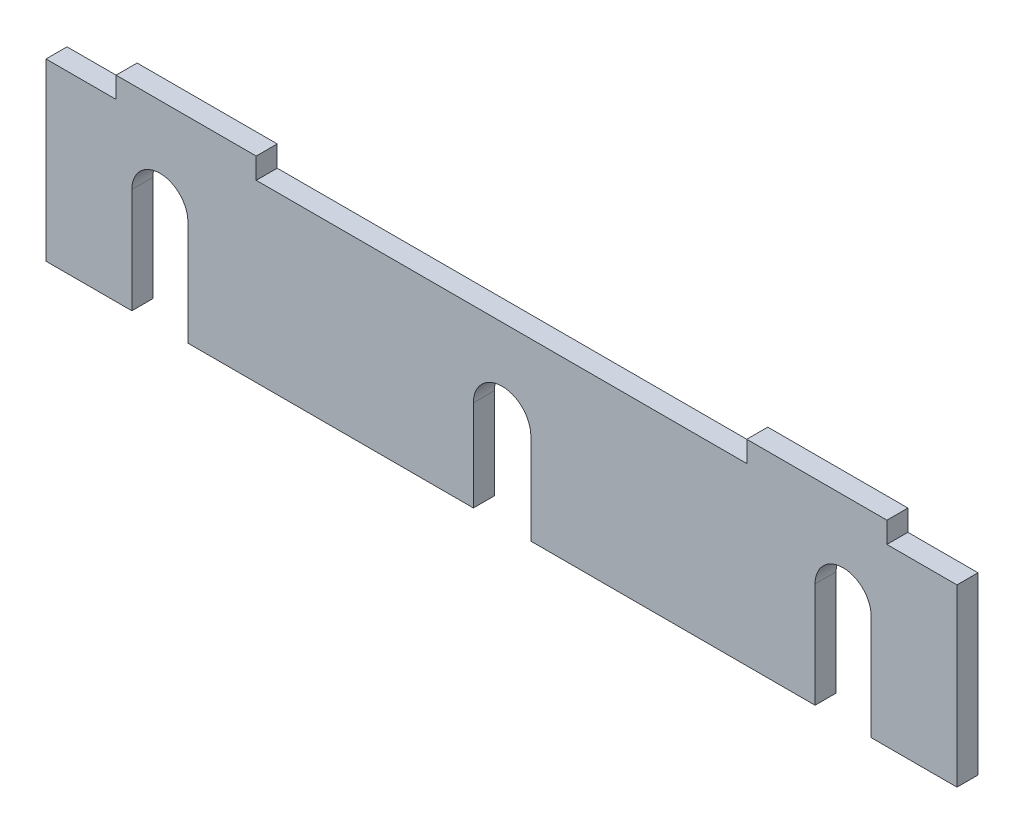
ISO-10303-21;
HEADER;
FILE_DESCRIPTION(('STEP AP214'),'2;1');
FILE_NAME('part.step','',(''),(''),'','','');
FILE_SCHEMA(('AUTOMOTIVE_DESIGN { 1 0 10303 214 1 1 1 1 }'));
ENDSEC;
DATA;
#1=APPLICATION_CONTEXT('core data for automotive mechanical design processes');
#2=APPLICATION_PROTOCOL_DEFINITION('international standard','automotive_design',2000,#1);
#3=PRODUCT_CONTEXT('',#1,'mechanical');
#4=PRODUCT('Part','Part','',(#3));
#5=PRODUCT_RELATED_PRODUCT_CATEGORY('part','',(#4));
#6=PRODUCT_DEFINITION_FORMATION('','',#4);
#7=PRODUCT_DEFINITION_CONTEXT('part definition',#1,'design');
#8=PRODUCT_DEFINITION('design','',#6,#7);
#9=PRODUCT_DEFINITION_SHAPE('','',#8);
#10=(LENGTH_UNIT() NAMED_UNIT(*) SI_UNIT(.MILLI.,.METRE.));
#11=(NAMED_UNIT(*) PLANE_ANGLE_UNIT() SI_UNIT($,.RADIAN.));
#12=(NAMED_UNIT(*) SI_UNIT($,.STERADIAN.) SOLID_ANGLE_UNIT());
#13=UNCERTAINTY_MEASURE_WITH_UNIT(LENGTH_MEASURE(1.E-05),#10,'distance_accuracy_value','');
#14=(GEOMETRIC_REPRESENTATION_CONTEXT(3) GLOBAL_UNCERTAINTY_ASSIGNED_CONTEXT((#13)) GLOBAL_UNIT_ASSIGNED_CONTEXT((#10,
#11,#12)) REPRESENTATION_CONTEXT('',''));
#15=CARTESIAN_POINT('',(0.,0.,0.));
#16=DIRECTION('',(0.,0.,1.));
#17=DIRECTION('',(1.,0.,0.));
#18=AXIS2_PLACEMENT_3D('',#15,#16,#17);
#19=CARTESIAN_POINT('',(10.,3.,3.));
#20=DIRECTION('',(0.,1.,0.));
#21=DIRECTION('',(0.,0.,1.));
#22=AXIS2_PLACEMENT_3D('',#19,#20,#21);
#23=PLANE('',#22);
#24=DIRECTION('',(1.,0.,0.));
#25=VECTOR('',#24,1.);
#26=CARTESIAN_POINT('',(10.,3.,0.));
#27=LINE('',#26,#25);
#28=CARTESIAN_POINT('',(10.,3.,0.));
#29=VERTEX_POINT('',#28);
#30=CARTESIAN_POINT('',(30.,3.,0.));
#31=VERTEX_POINT('',#30);
#32=EDGE_CURVE('E233',#29,#31,#27,.T.);
#33=ORIENTED_EDGE('',*,*,#32,.F.);
#34=DIRECTION('',(0.,0.,-1.));
#35=VECTOR('',#34,1.);
#36=CARTESIAN_POINT('',(10.,3.,3.));
#37=LINE('',#36,#35);
#38=CARTESIAN_POINT('',(10.,3.,3.));
#39=VERTEX_POINT('',#38);
#40=EDGE_CURVE('E11',#39,#29,#37,.T.);
#41=ORIENTED_EDGE('',*,*,#40,.F.);
#42=DIRECTION('',(1.,0.,0.));
#43=VECTOR('',#42,1.);
#44=CARTESIAN_POINT('',(10.,3.,3.));
#45=LINE('',#44,#43);
#46=CARTESIAN_POINT('',(30.,3.,3.));
#47=VERTEX_POINT('',#46);
#48=EDGE_CURVE('E322',#39,#47,#45,.T.);
#49=ORIENTED_EDGE('',*,*,#48,.T.);
#50=DIRECTION('',(0.,0.,-1.));
#51=VECTOR('',#50,1.);
#52=CARTESIAN_POINT('',(30.,3.,3.));
#53=LINE('',#52,#51);
#54=EDGE_CURVE('E41',#47,#31,#53,.T.);
#55=ORIENTED_EDGE('',*,*,#54,.T.);
#56=EDGE_LOOP('',(#33,#41,#49,#55));
#57=FACE_BOUND('',#56,.T.);
#58=ADVANCED_FACE('F38',(#57),#23,.T.);
#59=CARTESIAN_POINT('',(10.,0.,3.));
#60=DIRECTION('',(-1.,0.,0.));
#61=DIRECTION('',(0.,0.,1.));
#62=AXIS2_PLACEMENT_3D('',#59,#60,#61);
#63=PLANE('',#62);
#64=DIRECTION('',(0.,1.,0.));
#65=VECTOR('',#64,1.);
#66=CARTESIAN_POINT('',(10.,0.,0.));
#67=LINE('',#66,#65);
#68=CARTESIAN_POINT('',(10.,0.,0.));
#69=VERTEX_POINT('',#68);
#70=EDGE_CURVE('E319',#69,#29,#67,.T.);
#71=ORIENTED_EDGE('',*,*,#70,.F.);
#72=DIRECTION('',(0.,0.,-1.));
#73=VECTOR('',#72,1.);
#74=CARTESIAN_POINT('',(10.,0.,3.));
#75=LINE('',#74,#73);
#76=CARTESIAN_POINT('',(10.,0.,3.));
#77=VERTEX_POINT('',#76);
#78=EDGE_CURVE('E48',#77,#69,#75,.T.);
#79=ORIENTED_EDGE('',*,*,#78,.F.);
#80=DIRECTION('',(0.,1.,0.));
#81=VECTOR('',#80,1.);
#82=CARTESIAN_POINT('',(10.,0.,3.));
#83=LINE('',#82,#81);
#84=EDGE_CURVE('E226',#77,#39,#83,.T.);
#85=ORIENTED_EDGE('',*,*,#84,.T.);
#86=ORIENTED_EDGE('',*,*,#40,.T.);
#87=EDGE_LOOP('',(#71,#79,#85,#86));
#88=FACE_BOUND('',#87,.T.);
#89=ADVANCED_FACE('F391',(#88),#63,.T.);
#90=CARTESIAN_POINT('',(0.,0.,3.));
#91=DIRECTION('',(0.,1.,0.));
#92=DIRECTION('',(0.,0.,1.));
#93=AXIS2_PLACEMENT_3D('',#90,#91,#92);
#94=PLANE('',#93);
#95=DIRECTION('',(1.,0.,0.));
#96=VECTOR('',#95,1.);
#97=CARTESIAN_POINT('',(0.,0.,0.));
#98=LINE('',#97,#96);
#99=CARTESIAN_POINT('',(0.,0.,0.));
#100=VERTEX_POINT('',#99);
#101=EDGE_CURVE('E210',#100,#69,#98,.T.);
#102=ORIENTED_EDGE('',*,*,#101,.F.);
#103=DIRECTION('',(0.,0.,-1.));
#104=VECTOR('',#103,1.);
#105=CARTESIAN_POINT('',(0.,0.,3.));
#106=LINE('',#105,#104);
#107=CARTESIAN_POINT('',(0.,0.,3.));
#108=VERTEX_POINT('',#107);
#109=EDGE_CURVE('E204',#108,#100,#106,.T.);
#110=ORIENTED_EDGE('',*,*,#109,.F.);
#111=DIRECTION('',(1.,0.,0.));
#112=VECTOR('',#111,1.);
#113=CARTESIAN_POINT('',(0.,0.,3.));
#114=LINE('',#113,#112);
#115=EDGE_CURVE('E208',#108,#77,#114,.T.);
#116=ORIENTED_EDGE('',*,*,#115,.T.);
#117=ORIENTED_EDGE('',*,*,#78,.T.);
#118=EDGE_LOOP('',(#102,#110,#116,#117));
#119=FACE_BOUND('',#118,.T.);
#120=ADVANCED_FACE('F206',(#119),#94,.T.);
#121=CARTESIAN_POINT('',(0.,0.,3.));
#122=DIRECTION('',(1.,0.,0.));
#123=DIRECTION('',(0.,1.,0.));
#124=AXIS2_PLACEMENT_3D('',#121,#122,#123);
#125=PLANE('',#124);
#126=DIRECTION('',(0.,-1.,0.));
#127=VECTOR('',#126,1.);
#128=CARTESIAN_POINT('',(0.,0.,0.));
#129=LINE('',#128,#127);
#130=CARTESIAN_POINT('',(0.,-25.,0.));
#131=VERTEX_POINT('',#130);
#132=EDGE_CURVE('E314',#100,#131,#129,.T.);
#133=ORIENTED_EDGE('',*,*,#132,.T.);
#134=DIRECTION('',(0.,0.,-1.));
#135=VECTOR('',#134,1.);
#136=CARTESIAN_POINT('',(0.,-25.,3.));
#137=LINE('',#136,#135);
#138=CARTESIAN_POINT('',(0.,-25.,3.));
#139=VERTEX_POINT('',#138);
#140=EDGE_CURVE('E214',#139,#131,#137,.T.);
#141=ORIENTED_EDGE('',*,*,#140,.F.);
#142=DIRECTION('',(0.,-1.,0.));
#143=VECTOR('',#142,1.);
#144=CARTESIAN_POINT('',(0.,0.,3.));
#145=LINE('',#144,#143);
#146=EDGE_CURVE('E217',#108,#139,#145,.T.);
#147=ORIENTED_EDGE('',*,*,#146,.F.);
#148=ORIENTED_EDGE('',*,*,#109,.T.);
#149=EDGE_LOOP('',(#133,#141,#147,#148));
#150=FACE_BOUND('',#149,.T.);
#151=ADVANCED_FACE('F218',(#150),#125,.F.);
#152=CARTESIAN_POINT('',(0.,-25.,3.));
#153=DIRECTION('',(0.,1.,0.));
#154=DIRECTION('',(-1.,0.,0.));
#155=AXIS2_PLACEMENT_3D('',#152,#153,#154);
#156=PLANE('',#155);
#157=DIRECTION('',(1.,0.,0.));
#158=VECTOR('',#157,1.);
#159=CARTESIAN_POINT('',(0.,-25.,0.));
#160=LINE('',#159,#158);
#161=CARTESIAN_POINT('',(12.25,-25.,0.));
#162=VERTEX_POINT('',#161);
#163=EDGE_CURVE('E311',#131,#162,#160,.T.);
#164=ORIENTED_EDGE('',*,*,#163,.T.);
#165=DIRECTION('',(0.,0.,-1.));
#166=VECTOR('',#165,1.);
#167=CARTESIAN_POINT('',(12.25,-25.,3.));
#168=LINE('',#167,#166);
#169=CARTESIAN_POINT('',(12.25,-25.,3.));
#170=VERTEX_POINT('',#169);
#171=EDGE_CURVE('E328',#170,#162,#168,.T.);
#172=ORIENTED_EDGE('',*,*,#171,.F.);
#173=DIRECTION('',(1.,0.,0.));
#174=VECTOR('',#173,1.);
#175=CARTESIAN_POINT('',(0.,-25.,3.));
#176=LINE('',#175,#174);
#177=EDGE_CURVE('E223',#139,#170,#176,.T.);
#178=ORIENTED_EDGE('',*,*,#177,.F.);
#179=ORIENTED_EDGE('',*,*,#140,.T.);
#180=EDGE_LOOP('',(#164,#172,#178,#179));
#181=FACE_BOUND('',#180,.T.);
#182=ADVANCED_FACE('F404',(#181),#156,.F.);
#183=CARTESIAN_POINT('',(12.25,-25.,3.));
#184=DIRECTION('',(-1.,0.,0.));
#185=DIRECTION('',(0.,-1.,0.));
#186=AXIS2_PLACEMENT_3D('',#183,#184,#185);
#187=PLANE('',#186);
#188=DIRECTION('',(0.,1.,0.));
#189=VECTOR('',#188,1.);
#190=CARTESIAN_POINT('',(12.25,-25.,0.));
#191=LINE('',#190,#189);
#192=CARTESIAN_POINT('',(12.25,-10.,0.));
#193=VERTEX_POINT('',#192);
#194=EDGE_CURVE('E307',#162,#193,#191,.T.);
#195=ORIENTED_EDGE('',*,*,#194,.T.);
#196=DIRECTION('',(0.,0.,-1.));
#197=VECTOR('',#196,1.);
#198=CARTESIAN_POINT('',(12.25,-10.,3.));
#199=LINE('',#198,#197);
#200=CARTESIAN_POINT('',(12.25,-10.,3.));
#201=VERTEX_POINT('',#200);
#202=EDGE_CURVE('E332',#201,#193,#199,.T.);
#203=ORIENTED_EDGE('',*,*,#202,.F.);
#204=DIRECTION('',(0.,1.,0.));
#205=VECTOR('',#204,1.);
#206=CARTESIAN_POINT('',(12.25,-25.,3.));
#207=LINE('',#206,#205);
#208=EDGE_CURVE('E704',#170,#201,#207,.T.);
#209=ORIENTED_EDGE('',*,*,#208,.F.);
#210=ORIENTED_EDGE('',*,*,#171,.T.);
#211=EDGE_LOOP('',(#195,#203,#209,#210));
#212=FACE_BOUND('',#211,.T.);
#213=ADVANCED_FACE('F407',(#212),#187,.F.);
#214=CARTESIAN_POINT('',(16.25,-10.,3.));
#215=DIRECTION('',(0.,0.,-1.));
#216=DIRECTION('',(-1.,0.,0.));
#217=AXIS2_PLACEMENT_3D('',#214,#215,#216);
#218=CYLINDRICAL_SURFACE('',#217,4.);
#219=CARTESIAN_POINT('',(16.25,-10.,0.));
#220=DIRECTION('',(0.,0.,1.));
#221=DIRECTION('',(1.,0.,0.));
#222=AXIS2_PLACEMENT_3D('',#219,#220,#221);
#223=CIRCLE('',#222,4.);
#224=CARTESIAN_POINT('',(20.25,-10.,0.));
#225=VERTEX_POINT('',#224);
#226=EDGE_CURVE('E303',#225,#193,#223,.T.);
#227=ORIENTED_EDGE('',*,*,#226,.F.);
#228=DIRECTION('',(0.,0.,-1.));
#229=VECTOR('',#228,1.);
#230=CARTESIAN_POINT('',(20.25,-10.,3.));
#231=LINE('',#230,#229);
#232=CARTESIAN_POINT('',(20.25,-10.,3.));
#233=VERTEX_POINT('',#232);
#234=EDGE_CURVE('E335',#233,#225,#231,.T.);
#235=ORIENTED_EDGE('',*,*,#234,.F.);
#236=CARTESIAN_POINT('',(16.25,-10.,3.));
#237=DIRECTION('',(0.,0.,1.));
#238=DIRECTION('',(1.,0.,0.));
#239=AXIS2_PLACEMENT_3D('',#236,#237,#238);
#240=CIRCLE('',#239,4.);
#241=EDGE_CURVE('E699',#233,#201,#240,.T.);
#242=ORIENTED_EDGE('',*,*,#241,.T.);
#243=ORIENTED_EDGE('',*,*,#202,.T.);
#244=EDGE_LOOP('',(#227,#235,#242,#243));
#245=FACE_BOUND('',#244,.T.);
#246=ADVANCED_FACE('F411',(#245),#218,.F.);
#247=CARTESIAN_POINT('',(20.25,-10.,3.));
#248=DIRECTION('',(1.,0.,0.));
#249=DIRECTION('',(0.,0.,-1.));
#250=AXIS2_PLACEMENT_3D('',#247,#248,#249);
#251=PLANE('',#250);
#252=DIRECTION('',(0.,-1.,0.));
#253=VECTOR('',#252,1.);
#254=CARTESIAN_POINT('',(20.25,-10.,0.));
#255=LINE('',#254,#253);
#256=CARTESIAN_POINT('',(20.25,-25.,0.));
#257=VERTEX_POINT('',#256);
#258=EDGE_CURVE('E300',#225,#257,#255,.T.);
#259=ORIENTED_EDGE('',*,*,#258,.T.);
#260=DIRECTION('',(0.,0.,-1.));
#261=VECTOR('',#260,1.);
#262=CARTESIAN_POINT('',(20.25,-25.,3.));
#263=LINE('',#262,#261);
#264=CARTESIAN_POINT('',(20.25,-25.,3.));
#265=VERTEX_POINT('',#264);
#266=EDGE_CURVE('E338',#265,#257,#263,.T.);
#267=ORIENTED_EDGE('',*,*,#266,.F.);
#268=DIRECTION('',(0.,-1.,0.));
#269=VECTOR('',#268,1.);
#270=CARTESIAN_POINT('',(20.25,-10.,3.));
#271=LINE('',#270,#269);
#272=EDGE_CURVE('E693',#233,#265,#271,.T.);
#273=ORIENTED_EDGE('',*,*,#272,.F.);
#274=ORIENTED_EDGE('',*,*,#234,.T.);
#275=EDGE_LOOP('',(#259,#267,#273,#274));
#276=FACE_BOUND('',#275,.T.);
#277=ADVANCED_FACE('F415',(#276),#251,.F.);
#278=CARTESIAN_POINT('',(20.25,-25.,3.));
#279=DIRECTION('',(0.,1.,0.));
#280=DIRECTION('',(0.,0.,1.));
#281=AXIS2_PLACEMENT_3D('',#278,#279,#280);
#282=PLANE('',#281);
#283=DIRECTION('',(1.,0.,0.));
#284=VECTOR('',#283,1.);
#285=CARTESIAN_POINT('',(20.25,-25.,0.));
#286=LINE('',#285,#284);
#287=CARTESIAN_POINT('',(60.99,-25.,0.));
#288=VERTEX_POINT('',#287);
#289=EDGE_CURVE('E297',#257,#288,#286,.T.);
#290=ORIENTED_EDGE('',*,*,#289,.T.);
#291=DIRECTION('',(0.,0.,-1.));
#292=VECTOR('',#291,1.);
#293=CARTESIAN_POINT('',(60.99,-25.,3.));
#294=LINE('',#293,#292);
#295=CARTESIAN_POINT('',(60.99,-25.,3.));
#296=VERTEX_POINT('',#295);
#297=EDGE_CURVE('E342',#296,#288,#294,.T.);
#298=ORIENTED_EDGE('',*,*,#297,.F.);
#299=DIRECTION('',(1.,0.,0.));
#300=VECTOR('',#299,1.);
#301=CARTESIAN_POINT('',(20.25,-25.,3.));
#302=LINE('',#301,#300);
#303=EDGE_CURVE('E690',#265,#296,#302,.T.);
#304=ORIENTED_EDGE('',*,*,#303,.F.);
#305=ORIENTED_EDGE('',*,*,#266,.T.);
#306=EDGE_LOOP('',(#290,#298,#304,#305));
#307=FACE_BOUND('',#306,.T.);
#308=ADVANCED_FACE('F419',(#307),#282,.F.);
#309=CARTESIAN_POINT('',(60.99,-25.,3.));
#310=DIRECTION('',(-1.,0.,0.));
#311=DIRECTION('',(0.,0.,1.));
#312=AXIS2_PLACEMENT_3D('',#309,#310,#311);
#313=PLANE('',#312);
#314=DIRECTION('',(0.,1.,0.));
#315=VECTOR('',#314,1.);
#316=CARTESIAN_POINT('',(60.99,-25.,0.));
#317=LINE('',#316,#315);
#318=CARTESIAN_POINT('',(60.99,-12.,0.));
#319=VERTEX_POINT('',#318);
#320=EDGE_CURVE('E293',#288,#319,#317,.T.);
#321=ORIENTED_EDGE('',*,*,#320,.T.);
#322=DIRECTION('',(0.,0.,-1.));
#323=VECTOR('',#322,1.);
#324=CARTESIAN_POINT('',(60.99,-12.,3.));
#325=LINE('',#324,#323);
#326=CARTESIAN_POINT('',(60.99,-12.,3.));
#327=VERTEX_POINT('',#326);
#328=EDGE_CURVE('E346',#327,#319,#325,.T.);
#329=ORIENTED_EDGE('',*,*,#328,.F.);
#330=DIRECTION('',(0.,1.,0.));
#331=VECTOR('',#330,1.);
#332=CARTESIAN_POINT('',(60.99,-25.,3.));
#333=LINE('',#332,#331);
#334=EDGE_CURVE('E688',#296,#327,#333,.T.);
#335=ORIENTED_EDGE('',*,*,#334,.F.);
#336=ORIENTED_EDGE('',*,*,#297,.T.);
#337=EDGE_LOOP('',(#321,#329,#335,#336));
#338=FACE_BOUND('',#337,.T.);
#339=ADVANCED_FACE('F423',(#338),#313,.F.);
#340=CARTESIAN_POINT('',(65.09,-12.,3.));
#341=DIRECTION('',(0.,0.,-1.));
#342=DIRECTION('',(-1.,0.,0.));
#343=AXIS2_PLACEMENT_3D('',#340,#341,#342);
#344=CYLINDRICAL_SURFACE('',#343,4.1);
#345=CARTESIAN_POINT('',(65.09,-12.,0.));
#346=DIRECTION('',(0.,0.,1.));
#347=DIRECTION('',(1.,0.,0.));
#348=AXIS2_PLACEMENT_3D('',#345,#346,#347);
#349=CIRCLE('',#348,4.1);
#350=CARTESIAN_POINT('',(69.19,-12.,0.));
#351=VERTEX_POINT('',#350);
#352=EDGE_CURVE('E289',#351,#319,#349,.T.);
#353=ORIENTED_EDGE('',*,*,#352,.F.);
#354=DIRECTION('',(0.,0.,-1.));
#355=VECTOR('',#354,1.);
#356=CARTESIAN_POINT('',(69.19,-12.,3.));
#357=LINE('',#356,#355);
#358=CARTESIAN_POINT('',(69.19,-12.,3.));
#359=VERTEX_POINT('',#358);
#360=EDGE_CURVE('E349',#359,#351,#357,.T.);
#361=ORIENTED_EDGE('',*,*,#360,.F.);
#362=CARTESIAN_POINT('',(65.09,-12.,3.));
#363=DIRECTION('',(0.,0.,1.));
#364=DIRECTION('',(1.,0.,0.));
#365=AXIS2_PLACEMENT_3D('',#362,#363,#364);
#366=CIRCLE('',#365,4.1);
#367=EDGE_CURVE('E716',#359,#327,#366,.T.);
#368=ORIENTED_EDGE('',*,*,#367,.T.);
#369=ORIENTED_EDGE('',*,*,#328,.T.);
#370=EDGE_LOOP('',(#353,#361,#368,#369));
#371=FACE_BOUND('',#370,.T.);
#372=ADVANCED_FACE('F427',(#371),#344,.F.);
#373=CARTESIAN_POINT('',(69.19,-25.,3.));
#374=DIRECTION('',(-1.,0.,0.));
#375=DIRECTION('',(0.,0.,1.));
#376=AXIS2_PLACEMENT_3D('',#373,#374,#375);
#377=PLANE('',#376);
#378=DIRECTION('',(0.,1.,0.));
#379=VECTOR('',#378,1.);
#380=CARTESIAN_POINT('',(69.19,-25.,0.));
#381=LINE('',#380,#379);
#382=CARTESIAN_POINT('',(69.19,-25.,0.));
#383=VERTEX_POINT('',#382);
#384=EDGE_CURVE('E285',#383,#351,#381,.T.);
#385=ORIENTED_EDGE('',*,*,#384,.F.);
#386=DIRECTION('',(0.,0.,-1.));
#387=VECTOR('',#386,1.);
#388=CARTESIAN_POINT('',(69.19,-25.,3.));
#389=LINE('',#388,#387);
#390=CARTESIAN_POINT('',(69.19,-25.,3.));
#391=VERTEX_POINT('',#390);
#392=EDGE_CURVE('E352',#391,#383,#389,.T.);
#393=ORIENTED_EDGE('',*,*,#392,.F.);
#394=DIRECTION('',(0.,1.,0.));
#395=VECTOR('',#394,1.);
#396=CARTESIAN_POINT('',(69.19,-25.,3.));
#397=LINE('',#396,#395);
#398=EDGE_CURVE('E679',#391,#359,#397,.T.);
#399=ORIENTED_EDGE('',*,*,#398,.T.);
#400=ORIENTED_EDGE('',*,*,#360,.T.);
#401=EDGE_LOOP('',(#385,#393,#399,#400));
#402=FACE_BOUND('',#401,.T.);
#403=ADVANCED_FACE('F431',(#402),#377,.T.);
#404=CARTESIAN_POINT('',(109.75,-25.,3.));
#405=DIRECTION('',(0.,-1.,0.));
#406=DIRECTION('',(0.,0.,-1.));
#407=AXIS2_PLACEMENT_3D('',#404,#405,#406);
#408=PLANE('',#407);
#409=DIRECTION('',(-1.,0.,0.));
#410=VECTOR('',#409,1.);
#411=CARTESIAN_POINT('',(109.75,-25.,0.));
#412=LINE('',#411,#410);
#413=CARTESIAN_POINT('',(109.75,-25.,0.));
#414=VERTEX_POINT('',#413);
#415=EDGE_CURVE('E281',#414,#383,#412,.T.);
#416=ORIENTED_EDGE('',*,*,#415,.F.);
#417=DIRECTION('',(0.,0.,-1.));
#418=VECTOR('',#417,1.);
#419=CARTESIAN_POINT('',(109.75,-25.,3.));
#420=LINE('',#419,#418);
#421=CARTESIAN_POINT('',(109.75,-25.,3.));
#422=VERTEX_POINT('',#421);
#423=EDGE_CURVE('E355',#422,#414,#420,.T.);
#424=ORIENTED_EDGE('',*,*,#423,.F.);
#425=DIRECTION('',(-1.,0.,0.));
#426=VECTOR('',#425,1.);
#427=CARTESIAN_POINT('',(109.75,-25.,3.));
#428=LINE('',#427,#426);
#429=EDGE_CURVE('E675',#422,#391,#428,.T.);
#430=ORIENTED_EDGE('',*,*,#429,.T.);
#431=ORIENTED_EDGE('',*,*,#392,.T.);
#432=EDGE_LOOP('',(#416,#424,#430,#431));
#433=FACE_BOUND('',#432,.T.);
#434=ADVANCED_FACE('F435',(#433),#408,.T.);
#435=CARTESIAN_POINT('',(109.75,-10.,3.));
#436=DIRECTION('',(1.,0.,0.));
#437=DIRECTION('',(0.,0.,-1.));
#438=AXIS2_PLACEMENT_3D('',#435,#436,#437);
#439=PLANE('',#438);
#440=DIRECTION('',(0.,-1.,0.));
#441=VECTOR('',#440,1.);
#442=CARTESIAN_POINT('',(109.75,-10.,0.));
#443=LINE('',#442,#441);
#444=CARTESIAN_POINT('',(109.75,-10.,0.));
#445=VERTEX_POINT('',#444);
#446=EDGE_CURVE('E277',#445,#414,#443,.T.);
#447=ORIENTED_EDGE('',*,*,#446,.F.);
#448=DIRECTION('',(0.,0.,-1.));
#449=VECTOR('',#448,1.);
#450=CARTESIAN_POINT('',(109.75,-10.,3.));
#451=LINE('',#450,#449);
#452=CARTESIAN_POINT('',(109.75,-10.,3.));
#453=VERTEX_POINT('',#452);
#454=EDGE_CURVE('E358',#453,#445,#451,.T.);
#455=ORIENTED_EDGE('',*,*,#454,.F.);
#456=DIRECTION('',(0.,-1.,0.));
#457=VECTOR('',#456,1.);
#458=CARTESIAN_POINT('',(109.75,-10.,3.));
#459=LINE('',#458,#457);
#460=EDGE_CURVE('E723',#453,#422,#459,.T.);
#461=ORIENTED_EDGE('',*,*,#460,.T.);
#462=ORIENTED_EDGE('',*,*,#423,.T.);
#463=EDGE_LOOP('',(#447,#455,#461,#462));
#464=FACE_BOUND('',#463,.T.);
#465=ADVANCED_FACE('F439',(#464),#439,.T.);
#466=CARTESIAN_POINT('',(113.75,-10.,3.));
#467=DIRECTION('',(0.,0.,-1.));
#468=DIRECTION('',(-1.,0.,0.));
#469=AXIS2_PLACEMENT_3D('',#466,#467,#468);
#470=CYLINDRICAL_SURFACE('',#469,4.00000000000001);
#471=CARTESIAN_POINT('',(113.75,-10.,0.));
#472=DIRECTION('',(0.,0.,1.));
#473=DIRECTION('',(1.,0.,0.));
#474=AXIS2_PLACEMENT_3D('',#471,#472,#473);
#475=CIRCLE('',#474,4.00000000000001);
#476=CARTESIAN_POINT('',(117.75,-10.,0.));
#477=VERTEX_POINT('',#476);
#478=EDGE_CURVE('E273',#477,#445,#475,.T.);
#479=ORIENTED_EDGE('',*,*,#478,.F.);
#480=DIRECTION('',(0.,0.,-1.));
#481=VECTOR('',#480,1.);
#482=CARTESIAN_POINT('',(117.75,-10.,3.));
#483=LINE('',#482,#481);
#484=CARTESIAN_POINT('',(117.75,-10.,3.));
#485=VERTEX_POINT('',#484);
#486=EDGE_CURVE('E361',#485,#477,#483,.T.);
#487=ORIENTED_EDGE('',*,*,#486,.F.);
#488=CARTESIAN_POINT('',(113.75,-10.,3.));
#489=DIRECTION('',(0.,0.,1.));
#490=DIRECTION('',(1.,0.,0.));
#491=AXIS2_PLACEMENT_3D('',#488,#489,#490);
#492=CIRCLE('',#491,4.00000000000001);
#493=EDGE_CURVE('E668',#485,#453,#492,.T.);
#494=ORIENTED_EDGE('',*,*,#493,.T.);
#495=ORIENTED_EDGE('',*,*,#454,.T.);
#496=EDGE_LOOP('',(#479,#487,#494,#495));
#497=FACE_BOUND('',#496,.T.);
#498=ADVANCED_FACE('F443',(#497),#470,.F.);
#499=CARTESIAN_POINT('',(117.75,-25.,3.));
#500=DIRECTION('',(-1.,0.,0.));
#501=DIRECTION('',(0.,-1.,0.));
#502=AXIS2_PLACEMENT_3D('',#499,#500,#501);
#503=PLANE('',#502);
#504=DIRECTION('',(0.,1.,0.));
#505=VECTOR('',#504,1.);
#506=CARTESIAN_POINT('',(117.75,-25.,0.));
#507=LINE('',#506,#505);
#508=CARTESIAN_POINT('',(117.75,-25.,0.));
#509=VERTEX_POINT('',#508);
#510=EDGE_CURVE('E269',#509,#477,#507,.T.);
#511=ORIENTED_EDGE('',*,*,#510,.F.);
#512=DIRECTION('',(0.,0.,-1.));
#513=VECTOR('',#512,1.);
#514=CARTESIAN_POINT('',(117.75,-25.,3.));
#515=LINE('',#514,#513);
#516=CARTESIAN_POINT('',(117.75,-25.,3.));
#517=VERTEX_POINT('',#516);
#518=EDGE_CURVE('E364',#517,#509,#515,.T.);
#519=ORIENTED_EDGE('',*,*,#518,.F.);
#520=DIRECTION('',(0.,1.,0.));
#521=VECTOR('',#520,1.);
#522=CARTESIAN_POINT('',(117.75,-25.,3.));
#523=LINE('',#522,#521);
#524=EDGE_CURVE('E664',#517,#485,#523,.T.);
#525=ORIENTED_EDGE('',*,*,#524,.T.);
#526=ORIENTED_EDGE('',*,*,#486,.T.);
#527=EDGE_LOOP('',(#511,#519,#525,#526));
#528=FACE_BOUND('',#527,.T.);
#529=ADVANCED_FACE('F447',(#528),#503,.T.);
#530=CARTESIAN_POINT('',(130.,-25.,3.));
#531=DIRECTION('',(0.,-1.,0.));
#532=DIRECTION('',(0.,0.,-1.));
#533=AXIS2_PLACEMENT_3D('',#530,#531,#532);
#534=PLANE('',#533);
#535=DIRECTION('',(-1.,0.,0.));
#536=VECTOR('',#535,1.);
#537=CARTESIAN_POINT('',(130.,-25.,0.));
#538=LINE('',#537,#536);
#539=CARTESIAN_POINT('',(130.,-25.,0.));
#540=VERTEX_POINT('',#539);
#541=EDGE_CURVE('E265',#540,#509,#538,.T.);
#542=ORIENTED_EDGE('',*,*,#541,.F.);
#543=DIRECTION('',(0.,0.,-1.));
#544=VECTOR('',#543,1.);
#545=CARTESIAN_POINT('',(130.,-25.,3.));
#546=LINE('',#545,#544);
#547=CARTESIAN_POINT('',(130.,-25.,3.));
#548=VERTEX_POINT('',#547);
#549=EDGE_CURVE('E367',#548,#540,#546,.T.);
#550=ORIENTED_EDGE('',*,*,#549,.F.);
#551=DIRECTION('',(-1.,0.,0.));
#552=VECTOR('',#551,1.);
#553=CARTESIAN_POINT('',(130.,-25.,3.));
#554=LINE('',#553,#552);
#555=EDGE_CURVE('E730',#548,#517,#554,.T.);
#556=ORIENTED_EDGE('',*,*,#555,.T.);
#557=ORIENTED_EDGE('',*,*,#518,.T.);
#558=EDGE_LOOP('',(#542,#550,#556,#557));
#559=FACE_BOUND('',#558,.T.);
#560=ADVANCED_FACE('F451',(#559),#534,.T.);
#561=CARTESIAN_POINT('',(130.,0.,3.));
#562=DIRECTION('',(1.,0.,0.));
#563=DIRECTION('',(0.,0.,-1.));
#564=AXIS2_PLACEMENT_3D('',#561,#562,#563);
#565=PLANE('',#564);
#566=DIRECTION('',(0.,-1.,0.));
#567=VECTOR('',#566,1.);
#568=CARTESIAN_POINT('',(130.,0.,0.));
#569=LINE('',#568,#567);
#570=CARTESIAN_POINT('',(130.,0.,0.));
#571=VERTEX_POINT('',#570);
#572=EDGE_CURVE('E261',#571,#540,#569,.T.);
#573=ORIENTED_EDGE('',*,*,#572,.F.);
#574=DIRECTION('',(0.,0.,-1.));
#575=VECTOR('',#574,1.);
#576=CARTESIAN_POINT('',(130.,0.,3.));
#577=LINE('',#576,#575);
#578=CARTESIAN_POINT('',(130.,0.,3.));
#579=VERTEX_POINT('',#578);
#580=EDGE_CURVE('E370',#579,#571,#577,.T.);
#581=ORIENTED_EDGE('',*,*,#580,.F.);
#582=DIRECTION('',(0.,-1.,0.));
#583=VECTOR('',#582,1.);
#584=CARTESIAN_POINT('',(130.,0.,3.));
#585=LINE('',#584,#583);
#586=EDGE_CURVE('E657',#579,#548,#585,.T.);
#587=ORIENTED_EDGE('',*,*,#586,.T.);
#588=ORIENTED_EDGE('',*,*,#549,.T.);
#589=EDGE_LOOP('',(#573,#581,#587,#588));
#590=FACE_BOUND('',#589,.T.);
#591=ADVANCED_FACE('F455',(#590),#565,.T.);
#592=CARTESIAN_POINT('',(120.,0.,3.));
#593=DIRECTION('',(0.,1.,0.));
#594=DIRECTION('',(0.,0.,1.));
#595=AXIS2_PLACEMENT_3D('',#592,#593,#594);
#596=PLANE('',#595);
#597=DIRECTION('',(1.,0.,0.));
#598=VECTOR('',#597,1.);
#599=CARTESIAN_POINT('',(120.,0.,0.));
#600=LINE('',#599,#598);
#601=CARTESIAN_POINT('',(120.,0.,0.));
#602=VERTEX_POINT('',#601);
#603=EDGE_CURVE('E257',#602,#571,#600,.T.);
#604=ORIENTED_EDGE('',*,*,#603,.F.);
#605=DIRECTION('',(0.,0.,-1.));
#606=VECTOR('',#605,1.);
#607=CARTESIAN_POINT('',(120.,0.,3.));
#608=LINE('',#607,#606);
#609=CARTESIAN_POINT('',(120.,0.,3.));
#610=VERTEX_POINT('',#609);
#611=EDGE_CURVE('E373',#610,#602,#608,.T.);
#612=ORIENTED_EDGE('',*,*,#611,.F.);
#613=DIRECTION('',(1.,0.,0.));
#614=VECTOR('',#613,1.);
#615=CARTESIAN_POINT('',(120.,0.,3.));
#616=LINE('',#615,#614);
#617=EDGE_CURVE('E653',#610,#579,#616,.T.);
#618=ORIENTED_EDGE('',*,*,#617,.T.);
#619=ORIENTED_EDGE('',*,*,#580,.T.);
#620=EDGE_LOOP('',(#604,#612,#618,#619));
#621=FACE_BOUND('',#620,.T.);
#622=ADVANCED_FACE('F459',(#621),#596,.T.);
#623=CARTESIAN_POINT('',(120.,3.,3.));
#624=DIRECTION('',(1.,0.,0.));
#625=DIRECTION('',(0.,0.,-1.));
#626=AXIS2_PLACEMENT_3D('',#623,#624,#625);
#627=PLANE('',#626);
#628=DIRECTION('',(0.,-1.,0.));
#629=VECTOR('',#628,1.);
#630=CARTESIAN_POINT('',(120.,3.,0.));
#631=LINE('',#630,#629);
#632=CARTESIAN_POINT('',(120.,3.,0.));
#633=VERTEX_POINT('',#632);
#634=EDGE_CURVE('E253',#633,#602,#631,.T.);
#635=ORIENTED_EDGE('',*,*,#634,.F.);
#636=DIRECTION('',(0.,0.,-1.));
#637=VECTOR('',#636,1.);
#638=CARTESIAN_POINT('',(120.,3.,3.));
#639=LINE('',#638,#637);
#640=CARTESIAN_POINT('',(120.,3.,3.));
#641=VERTEX_POINT('',#640);
#642=EDGE_CURVE('E376',#641,#633,#639,.T.);
#643=ORIENTED_EDGE('',*,*,#642,.F.);
#644=DIRECTION('',(0.,-1.,0.));
#645=VECTOR('',#644,1.);
#646=CARTESIAN_POINT('',(120.,3.,3.));
#647=LINE('',#646,#645);
#648=EDGE_CURVE('E737',#641,#610,#647,.T.);
#649=ORIENTED_EDGE('',*,*,#648,.T.);
#650=ORIENTED_EDGE('',*,*,#611,.T.);
#651=EDGE_LOOP('',(#635,#643,#649,#650));
#652=FACE_BOUND('',#651,.T.);
#653=ADVANCED_FACE('F463',(#652),#627,.T.);
#654=CARTESIAN_POINT('',(100.,3.,3.));
#655=DIRECTION('',(0.,1.,0.));
#656=DIRECTION('',(0.,0.,1.));
#657=AXIS2_PLACEMENT_3D('',#654,#655,#656);
#658=PLANE('',#657);
#659=DIRECTION('',(1.,0.,0.));
#660=VECTOR('',#659,1.);
#661=CARTESIAN_POINT('',(100.,3.,0.));
#662=LINE('',#661,#660);
#663=CARTESIAN_POINT('',(100.,3.,0.));
#664=VERTEX_POINT('',#663);
#665=EDGE_CURVE('E249',#664,#633,#662,.T.);
#666=ORIENTED_EDGE('',*,*,#665,.F.);
#667=DIRECTION('',(0.,0.,-1.));
#668=VECTOR('',#667,1.);
#669=CARTESIAN_POINT('',(100.,3.,3.));
#670=LINE('',#669,#668);
#671=CARTESIAN_POINT('',(100.,3.,3.));
#672=VERTEX_POINT('',#671);
#673=EDGE_CURVE('E379',#672,#664,#670,.T.);
#674=ORIENTED_EDGE('',*,*,#673,.F.);
#675=DIRECTION('',(1.,0.,0.));
#676=VECTOR('',#675,1.);
#677=CARTESIAN_POINT('',(100.,3.,3.));
#678=LINE('',#677,#676);
#679=EDGE_CURVE('E646',#672,#641,#678,.T.);
#680=ORIENTED_EDGE('',*,*,#679,.T.);
#681=ORIENTED_EDGE('',*,*,#642,.T.);
#682=EDGE_LOOP('',(#666,#674,#680,#681));
#683=FACE_BOUND('',#682,.T.);
#684=ADVANCED_FACE('F467',(#683),#658,.T.);
#685=CARTESIAN_POINT('',(100.,0.,3.));
#686=DIRECTION('',(-1.,0.,0.));
#687=DIRECTION('',(0.,0.,1.));
#688=AXIS2_PLACEMENT_3D('',#685,#686,#687);
#689=PLANE('',#688);
#690=DIRECTION('',(0.,1.,0.));
#691=VECTOR('',#690,1.);
#692=CARTESIAN_POINT('',(100.,0.,0.));
#693=LINE('',#692,#691);
#694=CARTESIAN_POINT('',(100.,0.,0.));
#695=VERTEX_POINT('',#694);
#696=EDGE_CURVE('E245',#695,#664,#693,.T.);
#697=ORIENTED_EDGE('',*,*,#696,.F.);
#698=DIRECTION('',(0.,0.,-1.));
#699=VECTOR('',#698,1.);
#700=CARTESIAN_POINT('',(100.,0.,3.));
#701=LINE('',#700,#699);
#702=CARTESIAN_POINT('',(100.,0.,3.));
#703=VERTEX_POINT('',#702);
#704=EDGE_CURVE('E382',#703,#695,#701,.T.);
#705=ORIENTED_EDGE('',*,*,#704,.F.);
#706=DIRECTION('',(0.,1.,0.));
#707=VECTOR('',#706,1.);
#708=CARTESIAN_POINT('',(100.,0.,3.));
#709=LINE('',#708,#707);
#710=EDGE_CURVE('E642',#703,#672,#709,.T.);
#711=ORIENTED_EDGE('',*,*,#710,.T.);
#712=ORIENTED_EDGE('',*,*,#673,.T.);
#713=EDGE_LOOP('',(#697,#705,#711,#712));
#714=FACE_BOUND('',#713,.T.);
#715=ADVANCED_FACE('F471',(#714),#689,.T.);
#716=CARTESIAN_POINT('',(30.,0.,3.));
#717=DIRECTION('',(0.,1.,0.));
#718=DIRECTION('',(0.,0.,1.));
#719=AXIS2_PLACEMENT_3D('',#716,#717,#718);
#720=PLANE('',#719);
#721=DIRECTION('',(1.,0.,0.));
#722=VECTOR('',#721,1.);
#723=CARTESIAN_POINT('',(30.,0.,0.));
#724=LINE('',#723,#722);
#725=CARTESIAN_POINT('',(30.,0.,0.));
#726=VERTEX_POINT('',#725);
#727=EDGE_CURVE('E241',#726,#695,#724,.T.);
#728=ORIENTED_EDGE('',*,*,#727,.F.);
#729=DIRECTION('',(0.,0.,-1.));
#730=VECTOR('',#729,1.);
#731=CARTESIAN_POINT('',(30.,0.,3.));
#732=LINE('',#731,#730);
#733=CARTESIAN_POINT('',(30.,0.,3.));
#734=VERTEX_POINT('',#733);
#735=EDGE_CURVE('E384',#734,#726,#732,.T.);
#736=ORIENTED_EDGE('',*,*,#735,.F.);
#737=DIRECTION('',(1.,0.,0.));
#738=VECTOR('',#737,1.);
#739=CARTESIAN_POINT('',(30.,0.,3.));
#740=LINE('',#739,#738);
#741=EDGE_CURVE('E744',#734,#703,#740,.T.);
#742=ORIENTED_EDGE('',*,*,#741,.T.);
#743=ORIENTED_EDGE('',*,*,#704,.T.);
#744=EDGE_LOOP('',(#728,#736,#742,#743));
#745=FACE_BOUND('',#744,.T.);
#746=ADVANCED_FACE('F475',(#745),#720,.T.);
#747=CARTESIAN_POINT('',(30.,3.,3.));
#748=DIRECTION('',(1.,0.,0.));
#749=DIRECTION('',(0.,0.,-1.));
#750=AXIS2_PLACEMENT_3D('',#747,#748,#749);
#751=PLANE('',#750);
#752=DIRECTION('',(0.,-1.,0.));
#753=VECTOR('',#752,1.);
#754=CARTESIAN_POINT('',(30.,3.,0.));
#755=LINE('',#754,#753);
#756=EDGE_CURVE('E237',#31,#726,#755,.T.);
#757=ORIENTED_EDGE('',*,*,#756,.F.);
#758=ORIENTED_EDGE('',*,*,#54,.F.);
#759=DIRECTION('',(0.,-1.,0.));
#760=VECTOR('',#759,1.);
#761=CARTESIAN_POINT('',(30.,3.,3.));
#762=LINE('',#761,#760);
#763=EDGE_CURVE('E747',#47,#734,#762,.T.);
#764=ORIENTED_EDGE('',*,*,#763,.T.);
#765=ORIENTED_EDGE('',*,*,#735,.T.);
#766=EDGE_LOOP('',(#757,#758,#764,#765));
#767=FACE_BOUND('',#766,.T.);
#768=ADVANCED_FACE('F388',(#767),#751,.T.);
#769=CARTESIAN_POINT('',(113.75,-10.,3.));
#770=DIRECTION('',(0.,0.,1.));
#771=DIRECTION('',(1.,0.,0.));
#772=AXIS2_PLACEMENT_3D('',#769,#770,#771);
#773=PLANE('',#772);
#774=ORIENTED_EDGE('',*,*,#48,.F.);
#775=ORIENTED_EDGE('',*,*,#84,.F.);
#776=ORIENTED_EDGE('',*,*,#115,.F.);
#777=ORIENTED_EDGE('',*,*,#146,.T.);
#778=ORIENTED_EDGE('',*,*,#177,.T.);
#779=ORIENTED_EDGE('',*,*,#208,.T.);
#780=ORIENTED_EDGE('',*,*,#241,.F.);
#781=ORIENTED_EDGE('',*,*,#272,.T.);
#782=ORIENTED_EDGE('',*,*,#303,.T.);
#783=ORIENTED_EDGE('',*,*,#334,.T.);
#784=ORIENTED_EDGE('',*,*,#367,.F.);
#785=ORIENTED_EDGE('',*,*,#398,.F.);
#786=ORIENTED_EDGE('',*,*,#429,.F.);
#787=ORIENTED_EDGE('',*,*,#460,.F.);
#788=ORIENTED_EDGE('',*,*,#493,.F.);
#789=ORIENTED_EDGE('',*,*,#524,.F.);
#790=ORIENTED_EDGE('',*,*,#555,.F.);
#791=ORIENTED_EDGE('',*,*,#586,.F.);
#792=ORIENTED_EDGE('',*,*,#617,.F.);
#793=ORIENTED_EDGE('',*,*,#648,.F.);
#794=ORIENTED_EDGE('',*,*,#679,.F.);
#795=ORIENTED_EDGE('',*,*,#710,.F.);
#796=ORIENTED_EDGE('',*,*,#741,.F.);
#797=ORIENTED_EDGE('',*,*,#763,.F.);
#798=EDGE_LOOP('',(#774,#775,#776,#777,#778,#779,#780,#781,#782,#783,#784,#785,#786,#787,#788,
#789,#790,#791,#792,#793,#794,#795,#796,#797));
#799=FACE_BOUND('',#798,.T.);
#800=ADVANCED_FACE('F225',(#799),#773,.T.);
#801=CARTESIAN_POINT('',(113.75,-10.,0.));
#802=DIRECTION('',(0.,0.,1.));
#803=DIRECTION('',(1.,0.,0.));
#804=AXIS2_PLACEMENT_3D('',#801,#802,#803);
#805=PLANE('',#804);
#806=ORIENTED_EDGE('',*,*,#32,.T.);
#807=ORIENTED_EDGE('',*,*,#756,.T.);
#808=ORIENTED_EDGE('',*,*,#727,.T.);
#809=ORIENTED_EDGE('',*,*,#696,.T.);
#810=ORIENTED_EDGE('',*,*,#665,.T.);
#811=ORIENTED_EDGE('',*,*,#634,.T.);
#812=ORIENTED_EDGE('',*,*,#603,.T.);
#813=ORIENTED_EDGE('',*,*,#572,.T.);
#814=ORIENTED_EDGE('',*,*,#541,.T.);
#815=ORIENTED_EDGE('',*,*,#510,.T.);
#816=ORIENTED_EDGE('',*,*,#478,.T.);
#817=ORIENTED_EDGE('',*,*,#446,.T.);
#818=ORIENTED_EDGE('',*,*,#415,.T.);
#819=ORIENTED_EDGE('',*,*,#384,.T.);
#820=ORIENTED_EDGE('',*,*,#352,.T.);
#821=ORIENTED_EDGE('',*,*,#320,.F.);
#822=ORIENTED_EDGE('',*,*,#289,.F.);
#823=ORIENTED_EDGE('',*,*,#258,.F.);
#824=ORIENTED_EDGE('',*,*,#226,.T.);
#825=ORIENTED_EDGE('',*,*,#194,.F.);
#826=ORIENTED_EDGE('',*,*,#163,.F.);
#827=ORIENTED_EDGE('',*,*,#132,.F.);
#828=ORIENTED_EDGE('',*,*,#101,.T.);
#829=ORIENTED_EDGE('',*,*,#70,.T.);
#830=EDGE_LOOP('',(#806,#807,#808,#809,#810,#811,#812,#813,#814,#815,#816,#817,#818,#819,#820,
#821,#822,#823,#824,#825,#826,#827,#828,#829));
#831=FACE_BOUND('',#830,.T.);
#832=ADVANCED_FACE('F390',(#831),#805,.F.);
#833=CLOSED_SHELL('',(#58,#89,#120,#151,#182,#213,#246,#277,#308,#339,#372,#403,#434,#465,#498,
#529,#560,#591,#622,#653,#684,#715,#746,#768,#800,#832));
#834=MANIFOLD_SOLID_BREP('B2',#833);
#835=ADVANCED_BREP_SHAPE_REPRESENTATION('',(#18,#834),#14);
#836=SHAPE_DEFINITION_REPRESENTATION(#9,#835);
ENDSEC;
END-ISO-10303-21;
